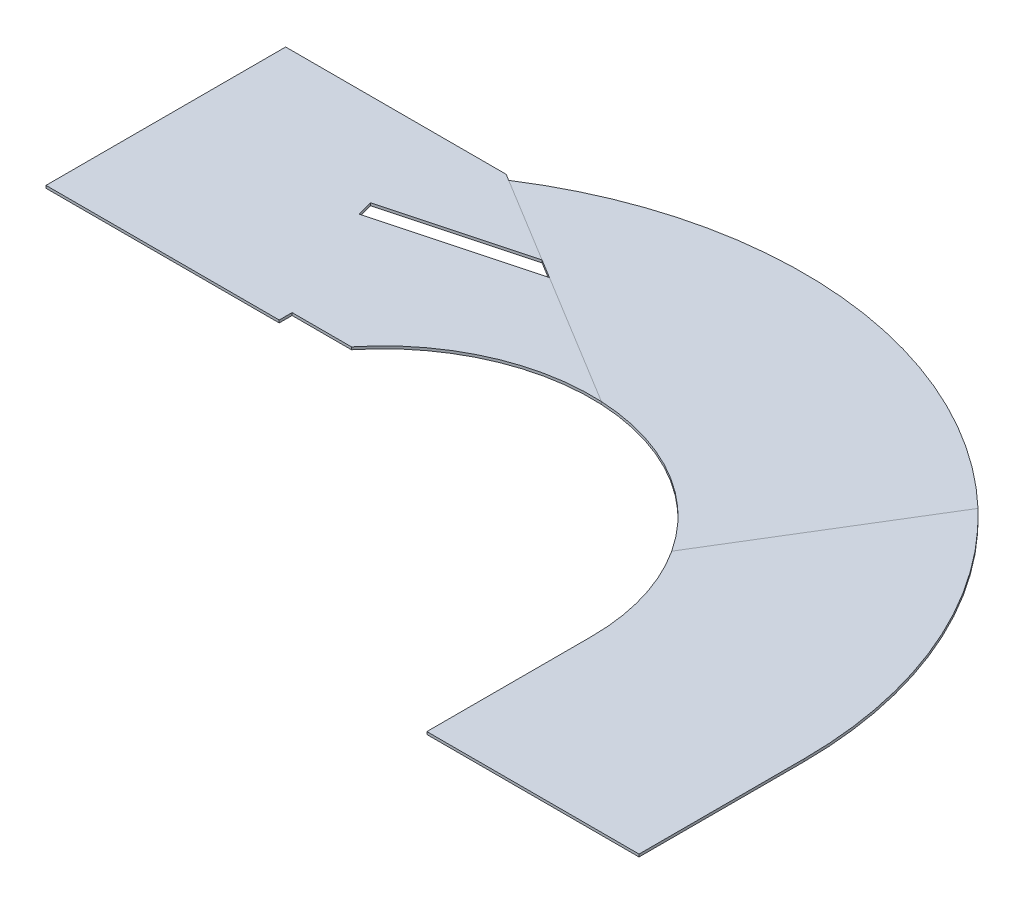
ISO-10303-21;
HEADER;
FILE_DESCRIPTION(('STEP AP214'),'2;1');
FILE_NAME('part.step','',(''),(''),'','','');
FILE_SCHEMA(('AUTOMOTIVE_DESIGN { 1 0 10303 214 1 1 1 1 }'));
ENDSEC;
DATA;
#1=APPLICATION_CONTEXT('core data for automotive mechanical design processes');
#2=APPLICATION_PROTOCOL_DEFINITION('international standard','automotive_design',2000,#1);
#3=PRODUCT_CONTEXT('',#1,'mechanical');
#4=PRODUCT('Part','Part','',(#3));
#5=PRODUCT_RELATED_PRODUCT_CATEGORY('part','',(#4));
#6=PRODUCT_DEFINITION_FORMATION('','',#4);
#7=PRODUCT_DEFINITION_CONTEXT('part definition',#1,'design');
#8=PRODUCT_DEFINITION('design','',#6,#7);
#9=PRODUCT_DEFINITION_SHAPE('','',#8);
#10=(LENGTH_UNIT() NAMED_UNIT(*) SI_UNIT(.MILLI.,.METRE.));
#11=(NAMED_UNIT(*) PLANE_ANGLE_UNIT() SI_UNIT($,.RADIAN.));
#12=(NAMED_UNIT(*) SI_UNIT($,.STERADIAN.) SOLID_ANGLE_UNIT());
#13=UNCERTAINTY_MEASURE_WITH_UNIT(LENGTH_MEASURE(1.E-05),#10,'distance_accuracy_value','');
#14=(GEOMETRIC_REPRESENTATION_CONTEXT(3) GLOBAL_UNCERTAINTY_ASSIGNED_CONTEXT((#13)) GLOBAL_UNIT_ASSIGNED_CONTEXT((#10,
#11,#12)) REPRESENTATION_CONTEXT('',''));
#15=CARTESIAN_POINT('',(0.,0.,0.));
#16=DIRECTION('',(0.,0.,1.));
#17=DIRECTION('',(1.,0.,0.));
#18=AXIS2_PLACEMENT_3D('',#15,#16,#17);
#19=CARTESIAN_POINT('',(118.465339808893,0.,-194.098878462848));
#20=DIRECTION('',(-0.520967590943229,0.,0.853576457727607));
#21=DIRECTION('',(0.853576457727607,0.,0.520967590943229));
#22=AXIS2_PLACEMENT_3D('',#19,#20,#21);
#23=PLANE('',#22);
#24=DIRECTION('',(0.,1.,0.));
#25=VECTOR('',#24,1.);
#26=CARTESIAN_POINT('',(-283.550675969538,0.,-439.463325156057));
#27=LINE('',#26,#25);
#28=CARTESIAN_POINT('',(-283.550675969538,0.,-439.463325156057));
#29=VERTEX_POINT('',#28);
#30=CARTESIAN_POINT('',(-283.550675969538,3.18,-439.463325156057));
#31=VERTEX_POINT('',#30);
#32=EDGE_CURVE('E101',#29,#31,#27,.T.);
#33=ORIENTED_EDGE('',*,*,#32,.F.);
#34=DIRECTION('',(0.853576457727607,0.,0.520967590943229));
#35=VECTOR('',#34,1.);
#36=CARTESIAN_POINT('',(118.465339808893,0.,-194.098878462848));
#37=LINE('',#36,#35);
#38=CARTESIAN_POINT('',(12.3219171348277,0.,-258.881924790284));
#39=VERTEX_POINT('',#38);
#40=EDGE_CURVE('E107',#29,#39,#37,.T.);
#41=ORIENTED_EDGE('',*,*,#40,.T.);
#42=DIRECTION('',(0.,-1.,0.));
#43=VECTOR('',#42,1.);
#44=CARTESIAN_POINT('',(12.3219171348277,3.18,-258.881924790284));
#45=LINE('',#44,#43);
#46=CARTESIAN_POINT('',(12.3219171348277,3.18,-258.881924790284));
#47=VERTEX_POINT('',#46);
#48=EDGE_CURVE('E110',#39,#47,#45,.F.);
#49=ORIENTED_EDGE('',*,*,#48,.T.);
#50=DIRECTION('',(0.853576457727607,0.,0.520967590943229));
#51=VECTOR('',#50,1.);
#52=CARTESIAN_POINT('',(213.779098453214,3.18,-135.925555176884));
#53=LINE('',#52,#51);
#54=EDGE_CURVE('E108',#31,#47,#53,.T.);
#55=ORIENTED_EDGE('',*,*,#54,.F.);
#56=EDGE_LOOP('',(#33,#41,#49,#55));
#57=FACE_BOUND('',#56,.T.);
#58=ADVANCED_FACE('F58',(#57),#23,.T.);
#59=CARTESIAN_POINT('',(0.,3.18,0.));
#60=DIRECTION('',(0.,1.,0.));
#61=DIRECTION('',(0.,0.,1.));
#62=AXIS2_PLACEMENT_3D('',#59,#60,#61);
#63=PLANE('',#62);
#64=CARTESIAN_POINT('',(0.,3.18,0.));
#65=DIRECTION('',(0.,1.,0.));
#66=DIRECTION('',(0.,0.,1.));
#67=AXIS2_PLACEMENT_3D('',#64,#65,#66);
#68=CIRCLE('',#67,523.);
#69=CARTESIAN_POINT('',(361.497178291315,3.18,-377.953423171979));
#70=VERTEX_POINT('',#69);
#71=EDGE_CURVE('E115',#70,#31,#68,.T.);
#72=ORIENTED_EDGE('',*,*,#71,.T.);
#73=ORIENTED_EDGE('',*,*,#54,.T.);
#74=CARTESIAN_POINT('',(0.,3.18,0.));
#75=DIRECTION('',(0.,-1.,0.));
#76=DIRECTION('',(0.,0.,1.));
#77=AXIS2_PLACEMENT_3D('',#74,#75,#76);
#78=CIRCLE('',#77,259.175);
#79=CARTESIAN_POINT('',(217.160975622658,3.18,-141.466573053903));
#80=VERTEX_POINT('',#79);
#81=EDGE_CURVE('E114',#47,#80,#78,.T.);
#82=ORIENTED_EDGE('',*,*,#81,.T.);
#83=DIRECTION('',(-0.520967590943227,0.,0.853576457727608));
#84=VECTOR('',#83,1.);
#85=CARTESIAN_POINT('',(95.3137586443211,3.18,58.1733232859641));
#86=LINE('',#85,#84);
#87=EDGE_CURVE('E126',#70,#80,#86,.T.);
#88=ORIENTED_EDGE('',*,*,#87,.F.);
#89=EDGE_LOOP('',(#72,#73,#82,#88));
#90=FACE_BOUND('',#89,.T.);
#91=ADVANCED_FACE('F131',(#90),#63,.T.);
#92=CARTESIAN_POINT('',(95.3137586443211,0.,58.1733232859641));
#93=DIRECTION('',(-0.853576457727608,0.,-0.520967590943227));
#94=DIRECTION('',(-0.520967590943227,0.,0.853576457727608));
#95=AXIS2_PLACEMENT_3D('',#92,#93,#94);
#96=PLANE('',#95);
#97=ORIENTED_EDGE('',*,*,#87,.T.);
#98=DIRECTION('',(0.,-1.,0.));
#99=VECTOR('',#98,1.);
#100=CARTESIAN_POINT('',(217.160975622658,3.18,-141.466573053903));
#101=LINE('',#100,#99);
#102=CARTESIAN_POINT('',(217.160975622658,0.,-141.466573053903));
#103=VERTEX_POINT('',#102);
#104=EDGE_CURVE('E121',#103,#80,#101,.F.);
#105=ORIENTED_EDGE('',*,*,#104,.F.);
#106=DIRECTION('',(-0.520967590943227,0.,0.853576457727608));
#107=VECTOR('',#106,1.);
#108=CARTESIAN_POINT('',(95.3137586443211,0.,58.1733232859641));
#109=LINE('',#108,#107);
#110=CARTESIAN_POINT('',(361.497178291315,0.,-377.953423171979));
#111=VERTEX_POINT('',#110);
#112=EDGE_CURVE('E116',#111,#103,#109,.T.);
#113=ORIENTED_EDGE('',*,*,#112,.F.);
#114=DIRECTION('',(0.,-1.,0.));
#115=VECTOR('',#114,1.);
#116=CARTESIAN_POINT('',(361.497178291315,3.18,-377.953423171979));
#117=LINE('',#116,#115);
#118=EDGE_CURVE('E73',#70,#111,#117,.T.);
#119=ORIENTED_EDGE('',*,*,#118,.F.);
#120=EDGE_LOOP('',(#97,#105,#113,#119));
#121=FACE_BOUND('',#120,.T.);
#122=ADVANCED_FACE('F130',(#121),#96,.F.);
#123=CARTESIAN_POINT('',(0.,0.,0.));
#124=DIRECTION('',(0.,1.,0.));
#125=DIRECTION('',(0.,0.,1.));
#126=AXIS2_PLACEMENT_3D('',#123,#124,#125);
#127=PLANE('',#126);
#128=ORIENTED_EDGE('',*,*,#40,.F.);
#129=CARTESIAN_POINT('',(0.,0.,0.));
#130=DIRECTION('',(0.,1.,0.));
#131=DIRECTION('',(0.,0.,1.));
#132=AXIS2_PLACEMENT_3D('',#129,#130,#131);
#133=CIRCLE('',#132,523.);
#134=EDGE_CURVE('E13',#111,#29,#133,.T.);
#135=ORIENTED_EDGE('',*,*,#134,.F.);
#136=ORIENTED_EDGE('',*,*,#112,.T.);
#137=CARTESIAN_POINT('',(0.,0.,0.));
#138=DIRECTION('',(0.,-1.,0.));
#139=DIRECTION('',(0.,0.,1.));
#140=AXIS2_PLACEMENT_3D('',#137,#138,#139);
#141=CIRCLE('',#140,259.175);
#142=EDGE_CURVE('E62',#39,#103,#141,.T.);
#143=ORIENTED_EDGE('',*,*,#142,.F.);
#144=EDGE_LOOP('',(#128,#135,#136,#143));
#145=FACE_BOUND('',#144,.T.);
#146=ADVANCED_FACE('F60',(#145),#127,.F.);
#147=CARTESIAN_POINT('',(0.,3.18,0.));
#148=DIRECTION('',(0.,-1.,0.));
#149=DIRECTION('',(0.,0.,-1.));
#150=AXIS2_PLACEMENT_3D('',#147,#148,#149);
#151=CYLINDRICAL_SURFACE('',#150,259.175);
#152=ORIENTED_EDGE('',*,*,#48,.F.);
#153=ORIENTED_EDGE('',*,*,#142,.T.);
#154=ORIENTED_EDGE('',*,*,#104,.T.);
#155=ORIENTED_EDGE('',*,*,#81,.F.);
#156=EDGE_LOOP('',(#152,#153,#154,#155));
#157=FACE_BOUND('',#156,.T.);
#158=ADVANCED_FACE('F142',(#157),#151,.F.);
#159=CARTESIAN_POINT('',(0.,3.18,0.));
#160=DIRECTION('',(0.,-1.,0.));
#161=DIRECTION('',(0.,0.,-1.));
#162=AXIS2_PLACEMENT_3D('',#159,#160,#161);
#163=CYLINDRICAL_SURFACE('',#162,523.);
#164=ORIENTED_EDGE('',*,*,#71,.F.);
#165=ORIENTED_EDGE('',*,*,#118,.T.);
#166=ORIENTED_EDGE('',*,*,#134,.T.);
#167=ORIENTED_EDGE('',*,*,#32,.T.);
#168=EDGE_LOOP('',(#164,#165,#166,#167));
#169=FACE_BOUND('',#168,.T.);
#170=ADVANCED_FACE('F100',(#169),#163,.T.);
#171=CLOSED_SHELL('',(#58,#91,#122,#146,#158,#170));
#172=MANIFOLD_SOLID_BREP('B2',#171);
#173=CARTESIAN_POINT('',(118.465339808893,0.,-194.098878462848));
#174=DIRECTION('',(-0.520967590943229,0.,0.853576457727607));
#175=DIRECTION('',(0.853576457727607,0.,0.520967590943229));
#176=AXIS2_PLACEMENT_3D('',#173,#174,#175);
#177=PLANE('',#176);
#178=DIRECTION('',(0.853576457727607,0.,0.520967590943229));
#179=VECTOR('',#178,1.);
#180=CARTESIAN_POINT('',(118.465339808893,0.,-194.098878462848));
#181=LINE('',#180,#179);
#182=CARTESIAN_POINT('',(-153.367558929916,0.,-360.008011866178));
#183=VERTEX_POINT('',#182);
#184=CARTESIAN_POINT('',(12.3219171348277,0.,-258.881924790284));
#185=VERTEX_POINT('',#184);
#186=EDGE_CURVE('E345',#183,#185,#181,.T.);
#187=ORIENTED_EDGE('',*,*,#186,.F.);
#188=DIRECTION('',(0.,1.,0.));
#189=VECTOR('',#188,1.);
#190=CARTESIAN_POINT('',(-153.367558929916,0.,-360.008011866178));
#191=LINE('',#190,#189);
#192=CARTESIAN_POINT('',(-153.367558929916,3.18,-360.008011866178));
#193=VERTEX_POINT('',#192);
#194=EDGE_CURVE('E303',#183,#193,#191,.T.);
#195=ORIENTED_EDGE('',*,*,#194,.T.);
#196=DIRECTION('',(0.853576457727607,0.,0.520967590943229));
#197=VECTOR('',#196,1.);
#198=CARTESIAN_POINT('',(213.779098453214,3.18,-135.925555176884));
#199=LINE('',#198,#197);
#200=CARTESIAN_POINT('',(12.3219171348277,3.18,-258.881924790284));
#201=VERTEX_POINT('',#200);
#202=EDGE_CURVE('E291',#193,#201,#199,.T.);
#203=ORIENTED_EDGE('',*,*,#202,.T.);
#204=DIRECTION('',(0.,-1.,0.));
#205=VECTOR('',#204,1.);
#206=CARTESIAN_POINT('',(12.3219171348277,3.18,-258.881924790284));
#207=LINE('',#206,#205);
#208=EDGE_CURVE('E350',#185,#201,#207,.F.);
#209=ORIENTED_EDGE('',*,*,#208,.F.);
#210=EDGE_LOOP('',(#187,#195,#203,#209));
#211=FACE_BOUND('',#210,.T.);
#212=ADVANCED_FACE('F190',(#211),#177,.F.);
#213=CARTESIAN_POINT('',(-291.606374577378,3.18,-444.38));
#214=VERTEX_POINT('',#213);
#215=CARTESIAN_POINT('',(-176.94252895302,3.18,-374.396641295101));
#216=VERTEX_POINT('',#215);
#217=EDGE_CURVE('E198',#214,#216,#199,.T.);
#218=ORIENTED_EDGE('',*,*,#217,.T.);
#219=DIRECTION('',(0.,-1.,0.));
#220=VECTOR('',#219,1.);
#221=CARTESIAN_POINT('',(-176.94252895302,0.,-374.396641295101));
#222=LINE('',#221,#220);
#223=CARTESIAN_POINT('',(-176.94252895302,0.,-374.396641295101));
#224=VERTEX_POINT('',#223);
#225=EDGE_CURVE('E299',#216,#224,#222,.T.);
#226=ORIENTED_EDGE('',*,*,#225,.T.);
#227=CARTESIAN_POINT('',(-291.606374577378,0.,-444.38));
#228=VERTEX_POINT('',#227);
#229=EDGE_CURVE('E347',#228,#224,#181,.T.);
#230=ORIENTED_EDGE('',*,*,#229,.F.);
#231=DIRECTION('',(0.,-1.,0.));
#232=VECTOR('',#231,1.);
#233=CARTESIAN_POINT('',(-291.606374577377,3.18,-444.38));
#234=LINE('',#233,#232);
#235=EDGE_CURVE('E213',#214,#228,#234,.T.);
#236=ORIENTED_EDGE('',*,*,#235,.F.);
#237=EDGE_LOOP('',(#218,#226,#230,#236));
#238=FACE_BOUND('',#237,.T.);
#239=ADVANCED_FACE('F192',(#238),#177,.F.);
#240=CARTESIAN_POINT('',(0.,3.18,0.));
#241=DIRECTION('',(0.,1.,0.));
#242=DIRECTION('',(0.,0.,1.));
#243=AXIS2_PLACEMENT_3D('',#240,#241,#242);
#244=PLANE('',#243);
#245=DIRECTION('',(-0.965925826289068,0.,0.258819045102522));
#246=VECTOR('',#245,1.);
#247=CARTESIAN_POINT('',(-88.8592851648427,3.18,-377.292951726656));
#248=LINE('',#247,#246);
#249=CARTESIAN_POINT('',(-340.,3.18,-310.));
#250=VERTEX_POINT('',#249);
#251=EDGE_CURVE('E275',#193,#250,#248,.T.);
#252=ORIENTED_EDGE('',*,*,#251,.T.);
#253=DIRECTION('',(-0.258819045102542,0.,-0.965925826289063));
#254=VECTOR('',#253,1.);
#255=CARTESIAN_POINT('',(-340.,3.18,-310.));
#256=LINE('',#255,#254);
#257=CARTESIAN_POINT('',(-345.176380902051,3.18,-329.318516525781));
#258=VERTEX_POINT('',#257);
#259=EDGE_CURVE('E282',#250,#258,#256,.T.);
#260=ORIENTED_EDGE('',*,*,#259,.T.);
#261=DIRECTION('',(0.965925826289068,0.,-0.258819045102522));
#262=VECTOR('',#261,1.);
#263=CARTESIAN_POINT('',(-345.176380902051,3.18,-329.318516525781));
#264=LINE('',#263,#262);
#265=EDGE_CURVE('E279',#258,#216,#264,.T.);
#266=ORIENTED_EDGE('',*,*,#265,.T.);
#267=ORIENTED_EDGE('',*,*,#217,.F.);
#268=DIRECTION('',(-1.,0.,0.));
#269=VECTOR('',#268,1.);
#270=CARTESIAN_POINT('',(-565.781463481504,3.18,-444.38));
#271=LINE('',#270,#269);
#272=CARTESIAN_POINT('',(-565.781463481504,3.18,-444.38));
#273=VERTEX_POINT('',#272);
#274=EDGE_CURVE('E306',#214,#273,#271,.T.);
#275=ORIENTED_EDGE('',*,*,#274,.T.);
#276=DIRECTION('',(0.,0.,1.));
#277=VECTOR('',#276,1.);
#278=CARTESIAN_POINT('',(-565.781463481504,3.18,-444.38));
#279=LINE('',#278,#277);
#280=CARTESIAN_POINT('',(-565.781463481504,3.18,-146.38));
#281=VERTEX_POINT('',#280);
#282=EDGE_CURVE('E308',#273,#281,#279,.T.);
#283=ORIENTED_EDGE('',*,*,#282,.T.);
#284=DIRECTION('',(1.,0.,0.));
#285=VECTOR('',#284,1.);
#286=CARTESIAN_POINT('',(-565.781463481504,3.18,-146.38));
#287=LINE('',#286,#285);
#288=CARTESIAN_POINT('',(-275.781463481504,3.18,-146.38));
#289=VERTEX_POINT('',#288);
#290=EDGE_CURVE('E311',#281,#289,#287,.T.);
#291=ORIENTED_EDGE('',*,*,#290,.T.);
#292=DIRECTION('',(0.,0.,-1.));
#293=VECTOR('',#292,1.);
#294=CARTESIAN_POINT('',(-275.781463481504,3.18,-162.38));
#295=LINE('',#294,#293);
#296=CARTESIAN_POINT('',(-275.781463481504,3.18,-162.38));
#297=VERTEX_POINT('',#296);
#298=EDGE_CURVE('E313',#289,#297,#295,.T.);
#299=ORIENTED_EDGE('',*,*,#298,.T.);
#300=DIRECTION('',(1.,0.,0.));
#301=VECTOR('',#300,1.);
#302=CARTESIAN_POINT('',(-275.781463481504,3.18,-162.38));
#303=LINE('',#302,#301);
#304=CARTESIAN_POINT('',(-202.001030257274,3.18,-162.38));
#305=VERTEX_POINT('',#304);
#306=EDGE_CURVE('E315',#297,#305,#303,.T.);
#307=ORIENTED_EDGE('',*,*,#306,.T.);
#308=CARTESIAN_POINT('',(0.,3.18,0.));
#309=DIRECTION('',(0.,-1.,0.));
#310=DIRECTION('',(0.,0.,1.));
#311=AXIS2_PLACEMENT_3D('',#308,#309,#310);
#312=CIRCLE('',#311,259.175);
#313=EDGE_CURVE('E317',#305,#201,#312,.T.);
#314=ORIENTED_EDGE('',*,*,#313,.T.);
#315=ORIENTED_EDGE('',*,*,#202,.F.);
#316=EDGE_LOOP('',(#252,#260,#266,#267,#275,#283,#291,#299,#307,#314,#315));
#317=FACE_BOUND('',#316,.T.);
#318=ADVANCED_FACE('F289',(#317),#244,.T.);
#319=CARTESIAN_POINT('',(-565.781463481504,3.18,-444.38));
#320=DIRECTION('',(0.,0.,1.));
#321=DIRECTION('',(1.,0.,0.));
#322=AXIS2_PLACEMENT_3D('',#319,#320,#321);
#323=PLANE('',#322);
#324=ORIENTED_EDGE('',*,*,#274,.F.);
#325=ORIENTED_EDGE('',*,*,#235,.T.);
#326=DIRECTION('',(-1.,0.,0.));
#327=VECTOR('',#326,1.);
#328=CARTESIAN_POINT('',(-565.781463481504,0.,-444.38));
#329=LINE('',#328,#327);
#330=CARTESIAN_POINT('',(-565.781463481504,0.,-444.38));
#331=VERTEX_POINT('',#330);
#332=EDGE_CURVE('E305',#228,#331,#329,.T.);
#333=ORIENTED_EDGE('',*,*,#332,.T.);
#334=DIRECTION('',(0.,-1.,0.));
#335=VECTOR('',#334,1.);
#336=CARTESIAN_POINT('',(-565.781463481504,3.18,-444.38));
#337=LINE('',#336,#335);
#338=EDGE_CURVE('E342',#273,#331,#337,.T.);
#339=ORIENTED_EDGE('',*,*,#338,.F.);
#340=EDGE_LOOP('',(#324,#325,#333,#339));
#341=FACE_BOUND('',#340,.T.);
#342=ADVANCED_FACE('F376',(#341),#323,.F.);
#343=CARTESIAN_POINT('',(-565.781463481504,3.18,-162.38));
#344=DIRECTION('',(1.,0.,0.));
#345=DIRECTION('',(0.,0.,-1.));
#346=AXIS2_PLACEMENT_3D('',#343,#344,#345);
#347=PLANE('',#346);
#348=DIRECTION('',(0.,0.,1.));
#349=VECTOR('',#348,1.);
#350=CARTESIAN_POINT('',(-565.781463481504,0.,-162.38));
#351=LINE('',#350,#349);
#352=CARTESIAN_POINT('',(-565.781463481504,0.,-146.38));
#353=VERTEX_POINT('',#352);
#354=EDGE_CURVE('E321',#331,#353,#351,.T.);
#355=ORIENTED_EDGE('',*,*,#354,.T.);
#356=DIRECTION('',(0.,-1.,0.));
#357=VECTOR('',#356,1.);
#358=CARTESIAN_POINT('',(-565.781463481504,3.18,-146.38));
#359=LINE('',#358,#357);
#360=EDGE_CURVE('E339',#281,#353,#359,.T.);
#361=ORIENTED_EDGE('',*,*,#360,.F.);
#362=ORIENTED_EDGE('',*,*,#282,.F.);
#363=ORIENTED_EDGE('',*,*,#338,.T.);
#364=EDGE_LOOP('',(#355,#361,#362,#363));
#365=FACE_BOUND('',#364,.T.);
#366=ADVANCED_FACE('F381',(#365),#347,.F.);
#367=CARTESIAN_POINT('',(-565.781463481504,3.18,-146.38));
#368=DIRECTION('',(0.,0.,-1.));
#369=DIRECTION('',(-1.,0.,0.));
#370=AXIS2_PLACEMENT_3D('',#367,#368,#369);
#371=PLANE('',#370);
#372=DIRECTION('',(1.,0.,0.));
#373=VECTOR('',#372,1.);
#374=CARTESIAN_POINT('',(-565.781463481504,0.,-146.38));
#375=LINE('',#374,#373);
#376=CARTESIAN_POINT('',(-275.781463481504,0.,-146.38));
#377=VERTEX_POINT('',#376);
#378=EDGE_CURVE('E323',#353,#377,#375,.T.);
#379=ORIENTED_EDGE('',*,*,#378,.T.);
#380=DIRECTION('',(0.,-1.,0.));
#381=VECTOR('',#380,1.);
#382=CARTESIAN_POINT('',(-275.781463481504,3.18,-146.38));
#383=LINE('',#382,#381);
#384=EDGE_CURVE('E336',#289,#377,#383,.T.);
#385=ORIENTED_EDGE('',*,*,#384,.F.);
#386=ORIENTED_EDGE('',*,*,#290,.F.);
#387=ORIENTED_EDGE('',*,*,#360,.T.);
#388=EDGE_LOOP('',(#379,#385,#386,#387));
#389=FACE_BOUND('',#388,.T.);
#390=ADVANCED_FACE('F385',(#389),#371,.F.);
#391=CARTESIAN_POINT('',(-275.781463481504,3.18,-162.38));
#392=DIRECTION('',(-1.,0.,0.));
#393=DIRECTION('',(0.,0.,1.));
#394=AXIS2_PLACEMENT_3D('',#391,#392,#393);
#395=PLANE('',#394);
#396=DIRECTION('',(0.,0.,-1.));
#397=VECTOR('',#396,1.);
#398=CARTESIAN_POINT('',(-275.781463481504,0.,-162.38));
#399=LINE('',#398,#397);
#400=CARTESIAN_POINT('',(-275.781463481504,0.,-162.38));
#401=VERTEX_POINT('',#400);
#402=EDGE_CURVE('E325',#377,#401,#399,.T.);
#403=ORIENTED_EDGE('',*,*,#402,.T.);
#404=DIRECTION('',(0.,-1.,0.));
#405=VECTOR('',#404,1.);
#406=CARTESIAN_POINT('',(-275.781463481504,3.18,-162.38));
#407=LINE('',#406,#405);
#408=EDGE_CURVE('E333',#297,#401,#407,.T.);
#409=ORIENTED_EDGE('',*,*,#408,.F.);
#410=ORIENTED_EDGE('',*,*,#298,.F.);
#411=ORIENTED_EDGE('',*,*,#384,.T.);
#412=EDGE_LOOP('',(#403,#409,#410,#411));
#413=FACE_BOUND('',#412,.T.);
#414=ADVANCED_FACE('F388',(#413),#395,.F.);
#415=CARTESIAN_POINT('',(-275.781463481504,3.18,-162.38));
#416=DIRECTION('',(0.,0.,-1.));
#417=DIRECTION('',(-1.,0.,0.));
#418=AXIS2_PLACEMENT_3D('',#415,#416,#417);
#419=PLANE('',#418);
#420=DIRECTION('',(1.,0.,0.));
#421=VECTOR('',#420,1.);
#422=CARTESIAN_POINT('',(-275.781463481504,0.,-162.38));
#423=LINE('',#422,#421);
#424=CARTESIAN_POINT('',(-202.001030257274,0.,-162.38));
#425=VERTEX_POINT('',#424);
#426=EDGE_CURVE('E327',#401,#425,#423,.T.);
#427=ORIENTED_EDGE('',*,*,#426,.T.);
#428=DIRECTION('',(0.,-1.,0.));
#429=VECTOR('',#428,1.);
#430=CARTESIAN_POINT('',(-202.001030257274,3.18,-162.38));
#431=LINE('',#430,#429);
#432=EDGE_CURVE('E319',#305,#425,#431,.T.);
#433=ORIENTED_EDGE('',*,*,#432,.F.);
#434=ORIENTED_EDGE('',*,*,#306,.F.);
#435=ORIENTED_EDGE('',*,*,#408,.T.);
#436=EDGE_LOOP('',(#427,#433,#434,#435));
#437=FACE_BOUND('',#436,.T.);
#438=ADVANCED_FACE('F366',(#437),#419,.F.);
#439=CARTESIAN_POINT('',(0.,3.18,0.));
#440=DIRECTION('',(0.,-1.,0.));
#441=DIRECTION('',(0.,0.,-1.));
#442=AXIS2_PLACEMENT_3D('',#439,#440,#441);
#443=CYLINDRICAL_SURFACE('',#442,259.175);
#444=CARTESIAN_POINT('',(0.,0.,0.));
#445=DIRECTION('',(0.,-1.,0.));
#446=DIRECTION('',(0.,0.,1.));
#447=AXIS2_PLACEMENT_3D('',#444,#445,#446);
#448=CIRCLE('',#447,259.175);
#449=EDGE_CURVE('E309',#425,#185,#448,.T.);
#450=ORIENTED_EDGE('',*,*,#449,.T.);
#451=ORIENTED_EDGE('',*,*,#208,.T.);
#452=ORIENTED_EDGE('',*,*,#313,.F.);
#453=ORIENTED_EDGE('',*,*,#432,.T.);
#454=EDGE_LOOP('',(#450,#451,#452,#453));
#455=FACE_BOUND('',#454,.T.);
#456=ADVANCED_FACE('F359',(#455),#443,.F.);
#457=CARTESIAN_POINT('',(0.,0.,0.));
#458=DIRECTION('',(0.,1.,0.));
#459=DIRECTION('',(0.,0.,1.));
#460=AXIS2_PLACEMENT_3D('',#457,#458,#459);
#461=PLANE('',#460);
#462=DIRECTION('',(-0.258819045102542,0.,-0.965925826289063));
#463=VECTOR('',#462,1.);
#464=CARTESIAN_POINT('',(-340.,0.,-310.));
#465=LINE('',#464,#463);
#466=CARTESIAN_POINT('',(-340.,0.,-310.));
#467=VERTEX_POINT('',#466);
#468=CARTESIAN_POINT('',(-345.176380902051,0.,-329.318516525781));
#469=VERTEX_POINT('',#468);
#470=EDGE_CURVE('E294',#467,#469,#465,.T.);
#471=ORIENTED_EDGE('',*,*,#470,.F.);
#472=DIRECTION('',(0.965925826289068,0.,-0.258819045102522));
#473=VECTOR('',#472,1.);
#474=CARTESIAN_POINT('',(-100.275681356646,0.,-374.233937586588));
#475=LINE('',#474,#473);
#476=EDGE_CURVE('E56',#467,#183,#475,.T.);
#477=ORIENTED_EDGE('',*,*,#476,.T.);
#478=ORIENTED_EDGE('',*,*,#186,.T.);
#479=ORIENTED_EDGE('',*,*,#449,.F.);
#480=ORIENTED_EDGE('',*,*,#426,.F.);
#481=ORIENTED_EDGE('',*,*,#402,.F.);
#482=ORIENTED_EDGE('',*,*,#378,.F.);
#483=ORIENTED_EDGE('',*,*,#354,.F.);
#484=ORIENTED_EDGE('',*,*,#332,.F.);
#485=ORIENTED_EDGE('',*,*,#229,.T.);
#486=DIRECTION('',(0.965925826289068,0.,-0.258819045102522));
#487=VECTOR('',#486,1.);
#488=CARTESIAN_POINT('',(-345.176380902051,0.,-329.318516525781));
#489=LINE('',#488,#487);
#490=EDGE_CURVE('E292',#469,#224,#489,.T.);
#491=ORIENTED_EDGE('',*,*,#490,.F.);
#492=EDGE_LOOP('',(#471,#477,#478,#479,#480,#481,#482,#483,#484,#485,#491));
#493=FACE_BOUND('',#492,.T.);
#494=ADVANCED_FACE('F369',(#493),#461,.F.);
#495=CARTESIAN_POINT('',(-88.8592851648427,3.18,-377.292951726656));
#496=DIRECTION('',(0.258819045102522,0.,0.965925826289068));
#497=DIRECTION('',(0.965925826289068,0.,-0.258819045102522));
#498=AXIS2_PLACEMENT_3D('',#495,#496,#497);
#499=PLANE('',#498);
#500=ORIENTED_EDGE('',*,*,#476,.F.);
#501=DIRECTION('',(0.,-1.,0.));
#502=VECTOR('',#501,1.);
#503=CARTESIAN_POINT('',(-340.,3.18,-310.));
#504=LINE('',#503,#502);
#505=EDGE_CURVE('E205',#250,#467,#504,.T.);
#506=ORIENTED_EDGE('',*,*,#505,.F.);
#507=ORIENTED_EDGE('',*,*,#251,.F.);
#508=ORIENTED_EDGE('',*,*,#194,.F.);
#509=EDGE_LOOP('',(#500,#506,#507,#508));
#510=FACE_BOUND('',#509,.T.);
#511=ADVANCED_FACE('F273',(#510),#499,.F.);
#512=CARTESIAN_POINT('',(-345.176380902051,3.18,-329.318516525781));
#513=DIRECTION('',(-0.258819045102522,0.,-0.965925826289068));
#514=DIRECTION('',(-0.965925826289068,0.,0.258819045102522));
#515=AXIS2_PLACEMENT_3D('',#512,#513,#514);
#516=PLANE('',#515);
#517=ORIENTED_EDGE('',*,*,#265,.F.);
#518=DIRECTION('',(0.,-1.,0.));
#519=VECTOR('',#518,1.);
#520=CARTESIAN_POINT('',(-345.176380902051,3.18,-329.318516525781));
#521=LINE('',#520,#519);
#522=EDGE_CURVE('E278',#258,#469,#521,.T.);
#523=ORIENTED_EDGE('',*,*,#522,.T.);
#524=ORIENTED_EDGE('',*,*,#490,.T.);
#525=ORIENTED_EDGE('',*,*,#225,.F.);
#526=EDGE_LOOP('',(#517,#523,#524,#525));
#527=FACE_BOUND('',#526,.T.);
#528=ADVANCED_FACE('F374',(#527),#516,.F.);
#529=CARTESIAN_POINT('',(-340.,3.18,-310.));
#530=DIRECTION('',(-0.965925826289062,0.,0.258819045102542));
#531=DIRECTION('',(0.258819045102542,0.,0.965925826289063));
#532=AXIS2_PLACEMENT_3D('',#529,#530,#531);
#533=PLANE('',#532);
#534=ORIENTED_EDGE('',*,*,#470,.T.);
#535=ORIENTED_EDGE('',*,*,#522,.F.);
#536=ORIENTED_EDGE('',*,*,#259,.F.);
#537=ORIENTED_EDGE('',*,*,#505,.T.);
#538=EDGE_LOOP('',(#534,#535,#536,#537));
#539=FACE_BOUND('',#538,.T.);
#540=ADVANCED_FACE('F283',(#539),#533,.F.);
#541=CLOSED_SHELL('',(#212,#239,#318,#342,#366,#390,#414,#438,#456,#494,#511,#528,#540));
#542=MANIFOLD_SOLID_BREP('B7',#541);
#543=CARTESIAN_POINT('',(95.3137586443211,0.,58.1733232859641));
#544=DIRECTION('',(-0.853576457727608,0.,-0.520967590943227));
#545=DIRECTION('',(-0.520967590943227,0.,0.853576457727608));
#546=AXIS2_PLACEMENT_3D('',#543,#544,#545);
#547=PLANE('',#546);
#548=DIRECTION('',(-0.520967590943227,0.,0.853576457727608));
#549=VECTOR('',#548,1.);
#550=CARTESIAN_POINT('',(95.3137586443211,3.18,58.1733232859641));
#551=LINE('',#550,#549);
#552=CARTESIAN_POINT('',(361.497178291315,3.18,-377.953423171979));
#553=VERTEX_POINT('',#552);
#554=CARTESIAN_POINT('',(217.160975622658,3.18,-141.466573053903));
#555=VERTEX_POINT('',#554);
#556=EDGE_CURVE('E563',#553,#555,#551,.T.);
#557=ORIENTED_EDGE('',*,*,#556,.F.);
#558=DIRECTION('',(0.,-1.,0.));
#559=VECTOR('',#558,1.);
#560=CARTESIAN_POINT('',(361.497178291315,3.18,-377.953423171979));
#561=LINE('',#560,#559);
#562=CARTESIAN_POINT('',(361.497178291315,0.,-377.953423171979));
#563=VERTEX_POINT('',#562);
#564=EDGE_CURVE('E554',#553,#563,#561,.T.);
#565=ORIENTED_EDGE('',*,*,#564,.T.);
#566=DIRECTION('',(-0.520967590943227,0.,0.853576457727608));
#567=VECTOR('',#566,1.);
#568=CARTESIAN_POINT('',(95.3137586443211,0.,58.1733232859641));
#569=LINE('',#568,#567);
#570=CARTESIAN_POINT('',(217.160975622658,0.,-141.466573053903));
#571=VERTEX_POINT('',#570);
#572=EDGE_CURVE('E562',#563,#571,#569,.T.);
#573=ORIENTED_EDGE('',*,*,#572,.T.);
#574=DIRECTION('',(0.,-1.,0.));
#575=VECTOR('',#574,1.);
#576=CARTESIAN_POINT('',(217.160975622658,3.18,-141.466573053903));
#577=LINE('',#576,#575);
#578=EDGE_CURVE('E564',#571,#555,#577,.F.);
#579=ORIENTED_EDGE('',*,*,#578,.T.);
#580=EDGE_LOOP('',(#557,#565,#573,#579));
#581=FACE_BOUND('',#580,.T.);
#582=ADVANCED_FACE('F491',(#581),#547,.T.);
#583=CARTESIAN_POINT('',(0.,3.18,0.));
#584=DIRECTION('',(0.,-1.,0.));
#585=DIRECTION('',(0.,0.,-1.));
#586=AXIS2_PLACEMENT_3D('',#583,#584,#585);
#587=CYLINDRICAL_SURFACE('',#586,523.);
#588=ORIENTED_EDGE('',*,*,#564,.F.);
#589=CARTESIAN_POINT('',(0.,3.18,0.));
#590=DIRECTION('',(0.,1.,0.));
#591=DIRECTION('',(0.,0.,1.));
#592=AXIS2_PLACEMENT_3D('',#589,#590,#591);
#593=CIRCLE('',#592,523.);
#594=CARTESIAN_POINT('',(523.,3.18,0.));
#595=VERTEX_POINT('',#594);
#596=EDGE_CURVE('E572',#595,#553,#593,.T.);
#597=ORIENTED_EDGE('',*,*,#596,.F.);
#598=DIRECTION('',(0.,-1.,0.));
#599=VECTOR('',#598,1.);
#600=CARTESIAN_POINT('',(523.,3.18,0.));
#601=LINE('',#600,#599);
#602=CARTESIAN_POINT('',(523.,0.,0.));
#603=VERTEX_POINT('',#602);
#604=EDGE_CURVE('E556',#595,#603,#601,.T.);
#605=ORIENTED_EDGE('',*,*,#604,.T.);
#606=CARTESIAN_POINT('',(0.,0.,0.));
#607=DIRECTION('',(0.,1.,0.));
#608=DIRECTION('',(0.,0.,1.));
#609=AXIS2_PLACEMENT_3D('',#606,#607,#608);
#610=CIRCLE('',#609,523.);
#611=EDGE_CURVE('E188',#603,#563,#610,.T.);
#612=ORIENTED_EDGE('',*,*,#611,.T.);
#613=EDGE_LOOP('',(#588,#597,#605,#612));
#614=FACE_BOUND('',#613,.T.);
#615=ADVANCED_FACE('F552',(#614),#587,.T.);
#616=CARTESIAN_POINT('',(0.,3.18,0.));
#617=DIRECTION('',(0.,-1.,0.));
#618=DIRECTION('',(0.,0.,-1.));
#619=AXIS2_PLACEMENT_3D('',#616,#617,#618);
#620=CYLINDRICAL_SURFACE('',#619,259.175);
#621=ORIENTED_EDGE('',*,*,#578,.F.);
#622=CARTESIAN_POINT('',(0.,0.,0.));
#623=DIRECTION('',(0.,-1.,0.));
#624=DIRECTION('',(0.,0.,1.));
#625=AXIS2_PLACEMENT_3D('',#622,#623,#624);
#626=CIRCLE('',#625,259.175);
#627=CARTESIAN_POINT('',(259.175,0.,0.));
#628=VERTEX_POINT('',#627);
#629=EDGE_CURVE('E500',#571,#628,#626,.T.);
#630=ORIENTED_EDGE('',*,*,#629,.T.);
#631=DIRECTION('',(0.,-1.,0.));
#632=VECTOR('',#631,1.);
#633=CARTESIAN_POINT('',(259.175,3.18,0.));
#634=LINE('',#633,#632);
#635=CARTESIAN_POINT('',(259.175,3.18,0.));
#636=VERTEX_POINT('',#635);
#637=EDGE_CURVE('E586',#636,#628,#634,.T.);
#638=ORIENTED_EDGE('',*,*,#637,.F.);
#639=CARTESIAN_POINT('',(0.,3.18,0.));
#640=DIRECTION('',(0.,-1.,0.));
#641=DIRECTION('',(0.,0.,1.));
#642=AXIS2_PLACEMENT_3D('',#639,#640,#641);
#643=CIRCLE('',#642,259.175);
#644=EDGE_CURVE('E530',#555,#636,#643,.T.);
#645=ORIENTED_EDGE('',*,*,#644,.F.);
#646=EDGE_LOOP('',(#621,#630,#638,#645));
#647=FACE_BOUND('',#646,.T.);
#648=ADVANCED_FACE('F609',(#647),#620,.F.);
#649=CARTESIAN_POINT('',(0.,3.18,0.));
#650=DIRECTION('',(0.,1.,0.));
#651=DIRECTION('',(0.,0.,1.));
#652=AXIS2_PLACEMENT_3D('',#649,#650,#651);
#653=PLANE('',#652);
#654=ORIENTED_EDGE('',*,*,#596,.T.);
#655=ORIENTED_EDGE('',*,*,#556,.T.);
#656=ORIENTED_EDGE('',*,*,#644,.T.);
#657=DIRECTION('',(0.,0.,1.));
#658=VECTOR('',#657,1.);
#659=CARTESIAN_POINT('',(259.175,3.18,0.));
#660=LINE('',#659,#658);
#661=CARTESIAN_POINT('',(259.175,3.18,205.));
#662=VERTEX_POINT('',#661);
#663=EDGE_CURVE('E525',#636,#662,#660,.T.);
#664=ORIENTED_EDGE('',*,*,#663,.T.);
#665=DIRECTION('',(1.,0.,0.));
#666=VECTOR('',#665,1.);
#667=CARTESIAN_POINT('',(259.175,3.18,205.));
#668=LINE('',#667,#666);
#669=CARTESIAN_POINT('',(523.,3.18,205.));
#670=VERTEX_POINT('',#669);
#671=EDGE_CURVE('E583',#662,#670,#668,.T.);
#672=ORIENTED_EDGE('',*,*,#671,.T.);
#673=DIRECTION('',(0.,0.,-1.));
#674=VECTOR('',#673,1.);
#675=CARTESIAN_POINT('',(523.,3.18,0.));
#676=LINE('',#675,#674);
#677=EDGE_CURVE('E581',#670,#595,#676,.T.);
#678=ORIENTED_EDGE('',*,*,#677,.T.);
#679=EDGE_LOOP('',(#654,#655,#656,#664,#672,#678));
#680=FACE_BOUND('',#679,.T.);
#681=ADVANCED_FACE('F493',(#680),#653,.T.);
#682=CARTESIAN_POINT('',(0.,0.,0.));
#683=DIRECTION('',(0.,1.,0.));
#684=DIRECTION('',(0.,0.,1.));
#685=AXIS2_PLACEMENT_3D('',#682,#683,#684);
#686=PLANE('',#685);
#687=ORIENTED_EDGE('',*,*,#572,.F.);
#688=ORIENTED_EDGE('',*,*,#611,.F.);
#689=DIRECTION('',(0.,0.,-1.));
#690=VECTOR('',#689,1.);
#691=CARTESIAN_POINT('',(523.,0.,0.));
#692=LINE('',#691,#690);
#693=CARTESIAN_POINT('',(523.,0.,205.));
#694=VERTEX_POINT('',#693);
#695=EDGE_CURVE('E537',#694,#603,#692,.T.);
#696=ORIENTED_EDGE('',*,*,#695,.F.);
#697=DIRECTION('',(1.,0.,0.));
#698=VECTOR('',#697,1.);
#699=CARTESIAN_POINT('',(259.175,0.,205.));
#700=LINE('',#699,#698);
#701=CARTESIAN_POINT('',(259.175,0.,205.));
#702=VERTEX_POINT('',#701);
#703=EDGE_CURVE('E574',#702,#694,#700,.T.);
#704=ORIENTED_EDGE('',*,*,#703,.F.);
#705=DIRECTION('',(0.,0.,1.));
#706=VECTOR('',#705,1.);
#707=CARTESIAN_POINT('',(259.175,0.,0.));
#708=LINE('',#707,#706);
#709=EDGE_CURVE('E573',#628,#702,#708,.T.);
#710=ORIENTED_EDGE('',*,*,#709,.F.);
#711=ORIENTED_EDGE('',*,*,#629,.F.);
#712=EDGE_LOOP('',(#687,#688,#696,#704,#710,#711));
#713=FACE_BOUND('',#712,.T.);
#714=ADVANCED_FACE('F566',(#713),#686,.F.);
#715=CARTESIAN_POINT('',(259.175,3.18,0.));
#716=DIRECTION('',(1.,0.,0.));
#717=DIRECTION('',(0.,0.,-1.));
#718=AXIS2_PLACEMENT_3D('',#715,#716,#717);
#719=PLANE('',#718);
#720=ORIENTED_EDGE('',*,*,#709,.T.);
#721=DIRECTION('',(0.,-1.,0.));
#722=VECTOR('',#721,1.);
#723=CARTESIAN_POINT('',(259.175,3.18,205.));
#724=LINE('',#723,#722);
#725=EDGE_CURVE('E587',#662,#702,#724,.T.);
#726=ORIENTED_EDGE('',*,*,#725,.F.);
#727=ORIENTED_EDGE('',*,*,#663,.F.);
#728=ORIENTED_EDGE('',*,*,#637,.T.);
#729=EDGE_LOOP('',(#720,#726,#727,#728));
#730=FACE_BOUND('',#729,.T.);
#731=ADVANCED_FACE('F600',(#730),#719,.F.);
#732=CARTESIAN_POINT('',(259.175,3.18,205.));
#733=DIRECTION('',(0.,0.,-1.));
#734=DIRECTION('',(-1.,0.,0.));
#735=AXIS2_PLACEMENT_3D('',#732,#733,#734);
#736=PLANE('',#735);
#737=ORIENTED_EDGE('',*,*,#703,.T.);
#738=DIRECTION('',(0.,-1.,0.));
#739=VECTOR('',#738,1.);
#740=CARTESIAN_POINT('',(523.,3.18,205.));
#741=LINE('',#740,#739);
#742=EDGE_CURVE('E589',#670,#694,#741,.T.);
#743=ORIENTED_EDGE('',*,*,#742,.F.);
#744=ORIENTED_EDGE('',*,*,#671,.F.);
#745=ORIENTED_EDGE('',*,*,#725,.T.);
#746=EDGE_LOOP('',(#737,#743,#744,#745));
#747=FACE_BOUND('',#746,.T.);
#748=ADVANCED_FACE('F599',(#747),#736,.F.);
#749=CARTESIAN_POINT('',(523.,3.18,0.));
#750=DIRECTION('',(-1.,0.,0.));
#751=DIRECTION('',(0.,0.,1.));
#752=AXIS2_PLACEMENT_3D('',#749,#750,#751);
#753=PLANE('',#752);
#754=ORIENTED_EDGE('',*,*,#695,.T.);
#755=ORIENTED_EDGE('',*,*,#604,.F.);
#756=ORIENTED_EDGE('',*,*,#677,.F.);
#757=ORIENTED_EDGE('',*,*,#742,.T.);
#758=EDGE_LOOP('',(#754,#755,#756,#757));
#759=FACE_BOUND('',#758,.T.);
#760=ADVANCED_FACE('F595',(#759),#753,.F.);
#761=CLOSED_SHELL('',(#582,#615,#648,#681,#714,#731,#748,#760));
#762=MANIFOLD_SOLID_BREP('B50',#761);
#763=ADVANCED_BREP_SHAPE_REPRESENTATION('',(#18,#172,#542,#762),#14);
#764=SHAPE_DEFINITION_REPRESENTATION(#9,#763);
ENDSEC;
END-ISO-10303-21;
